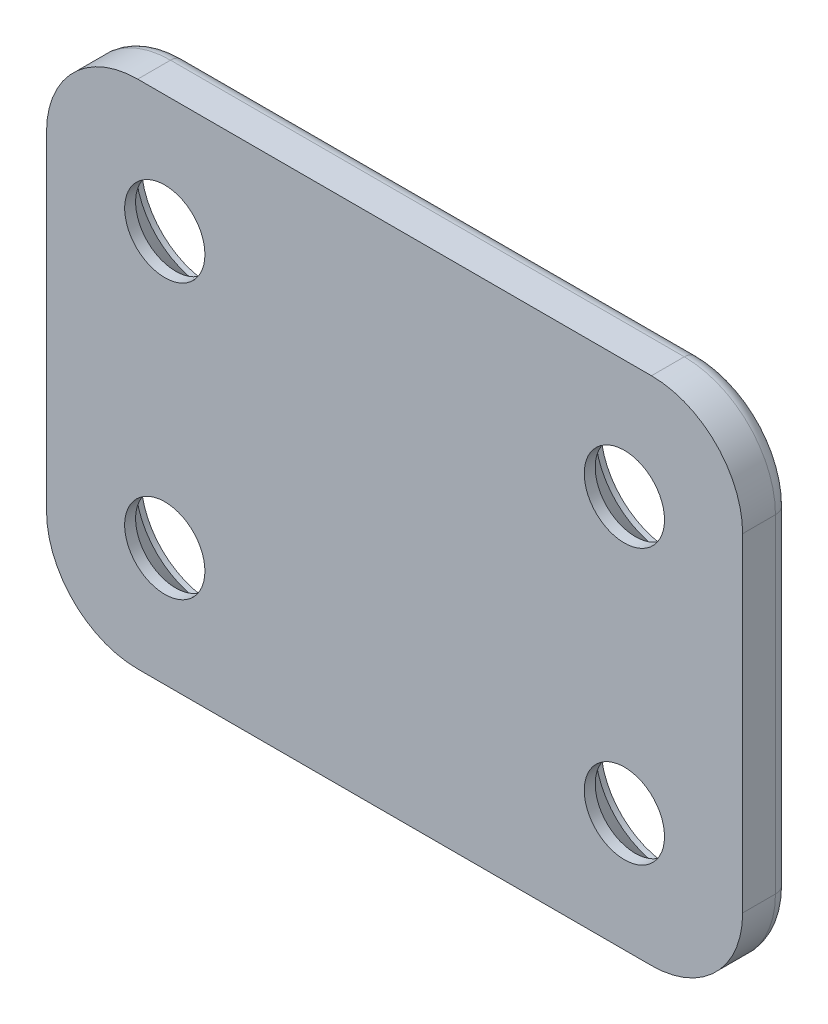
ISO-10303-21;
HEADER;
FILE_DESCRIPTION(('STEP AP214'),'2;1');
FILE_NAME('part.step','',(''),(''),'','','');
FILE_SCHEMA(('AUTOMOTIVE_DESIGN { 1 0 10303 214 1 1 1 1 }'));
ENDSEC;
DATA;
#1=APPLICATION_CONTEXT('core data for automotive mechanical design processes');
#2=APPLICATION_PROTOCOL_DEFINITION('international standard','automotive_design',2000,#1);
#3=PRODUCT_CONTEXT('',#1,'mechanical');
#4=PRODUCT('Part','Part','',(#3));
#5=PRODUCT_RELATED_PRODUCT_CATEGORY('part','',(#4));
#6=PRODUCT_DEFINITION_FORMATION('','',#4);
#7=PRODUCT_DEFINITION_CONTEXT('part definition',#1,'design');
#8=PRODUCT_DEFINITION('design','',#6,#7);
#9=PRODUCT_DEFINITION_SHAPE('','',#8);
#10=(LENGTH_UNIT() NAMED_UNIT(*) SI_UNIT(.MILLI.,.METRE.));
#11=(NAMED_UNIT(*) PLANE_ANGLE_UNIT() SI_UNIT($,.RADIAN.));
#12=(NAMED_UNIT(*) SI_UNIT($,.STERADIAN.) SOLID_ANGLE_UNIT());
#13=UNCERTAINTY_MEASURE_WITH_UNIT(LENGTH_MEASURE(1.E-05),#10,'distance_accuracy_value','');
#14=(GEOMETRIC_REPRESENTATION_CONTEXT(3) GLOBAL_UNCERTAINTY_ASSIGNED_CONTEXT((#13)) GLOBAL_UNIT_ASSIGNED_CONTEXT((#10,
#11,#12)) REPRESENTATION_CONTEXT('',''));
#15=CARTESIAN_POINT('',(0.,0.,0.));
#16=DIRECTION('',(0.,0.,1.));
#17=DIRECTION('',(1.,0.,0.));
#18=AXIS2_PLACEMENT_3D('',#15,#16,#17);
#19=CARTESIAN_POINT('',(6.3,3.76,0.15));
#20=DIRECTION('',(0.,0.,-1.));
#21=DIRECTION('',(1.,0.,0.));
#22=AXIS2_PLACEMENT_3D('',#19,#20,#21);
#23=CONICAL_SURFACE('',#22,1.95,0.785398163397);
#24=DIRECTION('',(-0.707106781186547,0.,0.707106781186547));
#25=VECTOR('',#24,1.);
#26=CARTESIAN_POINT('',(7.825,3.76,0.575));
#27=LINE('',#26,#25);
#28=CARTESIAN_POINT('',(8.25,3.76,0.15));
#29=VERTEX_POINT('',#28);
#30=CARTESIAN_POINT('',(7.4,3.76,1.));
#31=VERTEX_POINT('',#30);
#32=EDGE_CURVE('E10',#29,#31,#27,.T.);
#33=ORIENTED_EDGE('',*,*,#32,.T.);
#34=CARTESIAN_POINT('',(6.3,3.76,1.));
#35=DIRECTION('',(0.,0.,1.));
#36=DIRECTION('',(1.,0.,0.));
#37=AXIS2_PLACEMENT_3D('',#34,#35,#36);
#38=CIRCLE('',#37,1.1);
#39=EDGE_CURVE('E333',#31,#31,#38,.T.);
#40=ORIENTED_EDGE('',*,*,#39,.T.);
#41=ORIENTED_EDGE('',*,*,#32,.F.);
#42=CARTESIAN_POINT('',(6.3,3.76,0.15));
#43=DIRECTION('',(0.,0.,1.));
#44=DIRECTION('',(1.,0.,0.));
#45=AXIS2_PLACEMENT_3D('',#42,#43,#44);
#46=CIRCLE('',#45,1.95);
#47=EDGE_CURVE('E301',#29,#29,#46,.T.);
#48=ORIENTED_EDGE('',*,*,#47,.F.);
#49=EDGE_LOOP('',(#33,#40,#41,#48));
#50=FACE_BOUND('',#49,.T.);
#51=ADVANCED_FACE('F15',(#50),#23,.F.);
#52=CARTESIAN_POINT('',(-6.3,3.76,0.15));
#53=DIRECTION('',(0.,0.,-1.));
#54=DIRECTION('',(1.,0.,0.));
#55=AXIS2_PLACEMENT_3D('',#52,#53,#54);
#56=CONICAL_SURFACE('',#55,1.95,0.785398163397);
#57=DIRECTION('',(-0.707106781186547,0.,0.707106781186547));
#58=VECTOR('',#57,1.);
#59=CARTESIAN_POINT('',(-4.775,3.76,0.575));
#60=LINE('',#59,#58);
#61=CARTESIAN_POINT('',(-4.35,3.76,0.15));
#62=VERTEX_POINT('',#61);
#63=CARTESIAN_POINT('',(-5.2,3.76,1.));
#64=VERTEX_POINT('',#63);
#65=EDGE_CURVE('E26',#62,#64,#60,.T.);
#66=ORIENTED_EDGE('',*,*,#65,.T.);
#67=CARTESIAN_POINT('',(-6.3,3.76,1.));
#68=DIRECTION('',(0.,0.,1.));
#69=DIRECTION('',(1.,0.,0.));
#70=AXIS2_PLACEMENT_3D('',#67,#68,#69);
#71=CIRCLE('',#70,1.1);
#72=EDGE_CURVE('E325',#64,#64,#71,.T.);
#73=ORIENTED_EDGE('',*,*,#72,.T.);
#74=ORIENTED_EDGE('',*,*,#65,.F.);
#75=CARTESIAN_POINT('',(-6.3,3.76,0.15));
#76=DIRECTION('',(0.,0.,1.));
#77=DIRECTION('',(1.,0.,0.));
#78=AXIS2_PLACEMENT_3D('',#75,#76,#77);
#79=CIRCLE('',#78,1.95);
#80=EDGE_CURVE('E317',#62,#62,#79,.T.);
#81=ORIENTED_EDGE('',*,*,#80,.F.);
#82=EDGE_LOOP('',(#66,#73,#74,#81));
#83=FACE_BOUND('',#82,.T.);
#84=ADVANCED_FACE('F544',(#83),#56,.F.);
#85=CARTESIAN_POINT('',(6.3,-3.76,0.15));
#86=DIRECTION('',(0.,0.,-1.));
#87=DIRECTION('',(1.,0.,0.));
#88=AXIS2_PLACEMENT_3D('',#85,#86,#87);
#89=CONICAL_SURFACE('',#88,1.95,0.785398163397);
#90=DIRECTION('',(-0.707106781186547,0.,0.707106781186547));
#91=VECTOR('',#90,1.);
#92=CARTESIAN_POINT('',(7.825,-3.76,0.575));
#93=LINE('',#92,#91);
#94=CARTESIAN_POINT('',(8.25,-3.76,0.15));
#95=VERTEX_POINT('',#94);
#96=CARTESIAN_POINT('',(7.4,-3.76,1.));
#97=VERTEX_POINT('',#96);
#98=EDGE_CURVE('E291',#95,#97,#93,.T.);
#99=ORIENTED_EDGE('',*,*,#98,.T.);
#100=CARTESIAN_POINT('',(6.3,-3.76,1.));
#101=DIRECTION('',(0.,0.,1.));
#102=DIRECTION('',(1.,0.,0.));
#103=AXIS2_PLACEMENT_3D('',#100,#101,#102);
#104=CIRCLE('',#103,1.1);
#105=EDGE_CURVE('E326',#97,#97,#104,.T.);
#106=ORIENTED_EDGE('',*,*,#105,.T.);
#107=ORIENTED_EDGE('',*,*,#98,.F.);
#108=CARTESIAN_POINT('',(6.3,-3.76,0.15));
#109=DIRECTION('',(0.,0.,1.));
#110=DIRECTION('',(1.,0.,0.));
#111=AXIS2_PLACEMENT_3D('',#108,#109,#110);
#112=CIRCLE('',#111,1.95);
#113=EDGE_CURVE('E381',#95,#95,#112,.T.);
#114=ORIENTED_EDGE('',*,*,#113,.F.);
#115=EDGE_LOOP('',(#99,#106,#107,#114));
#116=FACE_BOUND('',#115,.T.);
#117=ADVANCED_FACE('F549',(#116),#89,.F.);
#118=CARTESIAN_POINT('',(-6.3,-3.76,0.15));
#119=DIRECTION('',(0.,0.,-1.));
#120=DIRECTION('',(1.,0.,0.));
#121=AXIS2_PLACEMENT_3D('',#118,#119,#120);
#122=CONICAL_SURFACE('',#121,1.95,0.785398163397);
#123=DIRECTION('',(-0.707106781186547,0.,0.707106781186547));
#124=VECTOR('',#123,1.);
#125=CARTESIAN_POINT('',(-4.775,-3.76,0.575));
#126=LINE('',#125,#124);
#127=CARTESIAN_POINT('',(-4.35,-3.76,0.15));
#128=VERTEX_POINT('',#127);
#129=CARTESIAN_POINT('',(-5.2,-3.76,1.));
#130=VERTEX_POINT('',#129);
#131=EDGE_CURVE('E19',#128,#130,#126,.T.);
#132=ORIENTED_EDGE('',*,*,#131,.T.);
#133=CARTESIAN_POINT('',(-6.3,-3.76,1.));
#134=DIRECTION('',(0.,0.,1.));
#135=DIRECTION('',(1.,0.,0.));
#136=AXIS2_PLACEMENT_3D('',#133,#134,#135);
#137=CIRCLE('',#136,1.1);
#138=EDGE_CURVE('E245',#130,#130,#137,.T.);
#139=ORIENTED_EDGE('',*,*,#138,.T.);
#140=ORIENTED_EDGE('',*,*,#131,.F.);
#141=CARTESIAN_POINT('',(-6.3,-3.76,0.15));
#142=DIRECTION('',(0.,0.,1.));
#143=DIRECTION('',(1.,0.,0.));
#144=AXIS2_PLACEMENT_3D('',#141,#142,#143);
#145=CIRCLE('',#144,1.95);
#146=EDGE_CURVE('E382',#128,#128,#145,.T.);
#147=ORIENTED_EDGE('',*,*,#146,.F.);
#148=EDGE_LOOP('',(#132,#139,#140,#147));
#149=FACE_BOUND('',#148,.T.);
#150=ADVANCED_FACE('F560',(#149),#122,.F.);
#151=CARTESIAN_POINT('',(6.3,3.76,0.));
#152=DIRECTION('',(0.,0.,-1.));
#153=DIRECTION('',(1.,0.,0.));
#154=AXIS2_PLACEMENT_3D('',#151,#152,#153);
#155=CYLINDRICAL_SURFACE('',#154,1.95);
#156=DIRECTION('',(0.,0.,1.));
#157=VECTOR('',#156,1.);
#158=CARTESIAN_POINT('',(8.25,3.76,0.));
#159=LINE('',#158,#157);
#160=CARTESIAN_POINT('',(8.25,3.76,0.));
#161=VERTEX_POINT('',#160);
#162=EDGE_CURVE('E309',#161,#29,#159,.T.);
#163=ORIENTED_EDGE('',*,*,#162,.T.);
#164=ORIENTED_EDGE('',*,*,#47,.T.);
#165=ORIENTED_EDGE('',*,*,#162,.F.);
#166=CARTESIAN_POINT('',(6.3,3.76,0.));
#167=DIRECTION('',(0.,0.,1.));
#168=DIRECTION('',(1.,0.,0.));
#169=AXIS2_PLACEMENT_3D('',#166,#167,#168);
#170=CIRCLE('',#169,1.95);
#171=EDGE_CURVE('E344',#161,#161,#170,.T.);
#172=ORIENTED_EDGE('',*,*,#171,.F.);
#173=EDGE_LOOP('',(#163,#164,#165,#172));
#174=FACE_BOUND('',#173,.T.);
#175=ADVANCED_FACE('F563',(#174),#155,.F.);
#176=CARTESIAN_POINT('',(-6.3,3.76,0.));
#177=DIRECTION('',(0.,0.,-1.));
#178=DIRECTION('',(1.,0.,0.));
#179=AXIS2_PLACEMENT_3D('',#176,#177,#178);
#180=CYLINDRICAL_SURFACE('',#179,1.95);
#181=DIRECTION('',(0.,0.,1.));
#182=VECTOR('',#181,1.);
#183=CARTESIAN_POINT('',(-4.35,3.76,0.));
#184=LINE('',#183,#182);
#185=CARTESIAN_POINT('',(-4.35,3.76,0.));
#186=VERTEX_POINT('',#185);
#187=EDGE_CURVE('E321',#186,#62,#184,.T.);
#188=ORIENTED_EDGE('',*,*,#187,.T.);
#189=ORIENTED_EDGE('',*,*,#80,.T.);
#190=ORIENTED_EDGE('',*,*,#187,.F.);
#191=CARTESIAN_POINT('',(-6.3,3.76,0.));
#192=DIRECTION('',(0.,0.,1.));
#193=DIRECTION('',(1.,0.,0.));
#194=AXIS2_PLACEMENT_3D('',#191,#192,#193);
#195=CIRCLE('',#194,1.95);
#196=EDGE_CURVE('E348',#186,#186,#195,.T.);
#197=ORIENTED_EDGE('',*,*,#196,.F.);
#198=EDGE_LOOP('',(#188,#189,#190,#197));
#199=FACE_BOUND('',#198,.T.);
#200=ADVANCED_FACE('F467',(#199),#180,.F.);
#201=CARTESIAN_POINT('',(6.3,-3.76,0.));
#202=DIRECTION('',(0.,0.,-1.));
#203=DIRECTION('',(1.,0.,0.));
#204=AXIS2_PLACEMENT_3D('',#201,#202,#203);
#205=CYLINDRICAL_SURFACE('',#204,1.95);
#206=DIRECTION('',(0.,0.,1.));
#207=VECTOR('',#206,1.);
#208=CARTESIAN_POINT('',(8.25,-3.76,0.));
#209=LINE('',#208,#207);
#210=CARTESIAN_POINT('',(8.25,-3.76,0.));
#211=VERTEX_POINT('',#210);
#212=EDGE_CURVE('E377',#211,#95,#209,.T.);
#213=ORIENTED_EDGE('',*,*,#212,.T.);
#214=ORIENTED_EDGE('',*,*,#113,.T.);
#215=ORIENTED_EDGE('',*,*,#212,.F.);
#216=CARTESIAN_POINT('',(6.3,-3.76,0.));
#217=DIRECTION('',(0.,0.,1.));
#218=DIRECTION('',(1.,0.,0.));
#219=AXIS2_PLACEMENT_3D('',#216,#217,#218);
#220=CIRCLE('',#219,1.95);
#221=EDGE_CURVE('E278',#211,#211,#220,.T.);
#222=ORIENTED_EDGE('',*,*,#221,.F.);
#223=EDGE_LOOP('',(#213,#214,#215,#222));
#224=FACE_BOUND('',#223,.T.);
#225=ADVANCED_FACE('F554',(#224),#205,.F.);
#226=CARTESIAN_POINT('',(-6.3,-3.76,0.));
#227=DIRECTION('',(0.,0.,-1.));
#228=DIRECTION('',(1.,0.,0.));
#229=AXIS2_PLACEMENT_3D('',#226,#227,#228);
#230=CYLINDRICAL_SURFACE('',#229,1.95);
#231=DIRECTION('',(0.,0.,1.));
#232=VECTOR('',#231,1.);
#233=CARTESIAN_POINT('',(-4.35,-3.76,0.));
#234=LINE('',#233,#232);
#235=CARTESIAN_POINT('',(-4.35,-3.76,0.));
#236=VERTEX_POINT('',#235);
#237=EDGE_CURVE('E338',#236,#128,#234,.T.);
#238=ORIENTED_EDGE('',*,*,#237,.T.);
#239=ORIENTED_EDGE('',*,*,#146,.T.);
#240=ORIENTED_EDGE('',*,*,#237,.F.);
#241=CARTESIAN_POINT('',(-6.3,-3.76,0.));
#242=DIRECTION('',(0.,0.,1.));
#243=DIRECTION('',(1.,0.,0.));
#244=AXIS2_PLACEMENT_3D('',#241,#242,#243);
#245=CIRCLE('',#244,1.95);
#246=EDGE_CURVE('E274',#236,#236,#245,.T.);
#247=ORIENTED_EDGE('',*,*,#246,.F.);
#248=EDGE_LOOP('',(#238,#239,#240,#247));
#249=FACE_BOUND('',#248,.T.);
#250=ADVANCED_FACE('F557',(#249),#230,.F.);
#251=CARTESIAN_POINT('',(9.1425,4.5025,0.4));
#252=DIRECTION('',(0.,-1.,0.));
#253=DIRECTION('',(1.,0.,0.));
#254=AXIS2_PLACEMENT_3D('',#251,#252,#253);
#255=CYLINDRICAL_SURFACE('',#254,0.4);
#256=DIRECTION('',(0.,-1.,0.));
#257=VECTOR('',#256,1.);
#258=CARTESIAN_POINT('',(9.5425,4.5025,0.4));
#259=LINE('',#258,#257);
#260=CARTESIAN_POINT('',(9.5425,4.5025,0.4));
#261=VERTEX_POINT('',#260);
#262=CARTESIAN_POINT('',(9.5425,-4.5025,0.4));
#263=VERTEX_POINT('',#262);
#264=EDGE_CURVE('E249',#261,#263,#259,.T.);
#265=ORIENTED_EDGE('',*,*,#264,.T.);
#266=CARTESIAN_POINT('',(9.1425,-4.5025,0.4));
#267=DIRECTION('',(0.,1.,0.));
#268=DIRECTION('',(1.,0.,0.));
#269=AXIS2_PLACEMENT_3D('',#266,#267,#268);
#270=CIRCLE('',#269,0.4);
#271=CARTESIAN_POINT('',(9.1425,-4.5025,0.));
#272=VERTEX_POINT('',#271);
#273=EDGE_CURVE('E238',#263,#272,#270,.T.);
#274=ORIENTED_EDGE('',*,*,#273,.T.);
#275=DIRECTION('',(0.,-1.,0.));
#276=VECTOR('',#275,1.);
#277=CARTESIAN_POINT('',(9.1425,4.5025,0.));
#278=LINE('',#277,#276);
#279=CARTESIAN_POINT('',(9.1425,4.5025,0.));
#280=VERTEX_POINT('',#279);
#281=EDGE_CURVE('E261',#280,#272,#278,.T.);
#282=ORIENTED_EDGE('',*,*,#281,.F.);
#283=CARTESIAN_POINT('',(9.1425,4.5025,0.4));
#284=DIRECTION('',(0.,1.,0.));
#285=DIRECTION('',(1.,0.,0.));
#286=AXIS2_PLACEMENT_3D('',#283,#284,#285);
#287=CIRCLE('',#286,0.4);
#288=EDGE_CURVE('E329',#261,#280,#287,.T.);
#289=ORIENTED_EDGE('',*,*,#288,.F.);
#290=EDGE_LOOP('',(#265,#274,#282,#289));
#291=FACE_BOUND('',#290,.T.);
#292=ADVANCED_FACE('F493',(#291),#255,.T.);
#293=CARTESIAN_POINT('',(7.0425,4.5025,0.4));
#294=DIRECTION('',(0.,0.,-1.));
#295=DIRECTION('',(0.,1.,0.));
#296=AXIS2_PLACEMENT_3D('',#293,#294,#295);
#297=TOROIDAL_SURFACE('',#296,2.1,0.4);
#298=CARTESIAN_POINT('',(7.0425,6.6025,0.4));
#299=DIRECTION('',(-1.,0.,0.));
#300=DIRECTION('',(0.,1.,0.));
#301=AXIS2_PLACEMENT_3D('',#298,#299,#300);
#302=CIRCLE('',#301,0.4);
#303=CARTESIAN_POINT('',(7.0425,7.0025,0.4));
#304=VERTEX_POINT('',#303);
#305=CARTESIAN_POINT('',(7.0425,6.6025,0.));
#306=VERTEX_POINT('',#305);
#307=EDGE_CURVE('E236',#304,#306,#302,.T.);
#308=ORIENTED_EDGE('',*,*,#307,.F.);
#309=CARTESIAN_POINT('',(7.0425,4.5025,0.4));
#310=DIRECTION('',(0.,0.,-1.));
#311=DIRECTION('',(0.,1.,0.));
#312=AXIS2_PLACEMENT_3D('',#309,#310,#311);
#313=CIRCLE('',#312,2.5);
#314=EDGE_CURVE('E207',#304,#261,#313,.T.);
#315=ORIENTED_EDGE('',*,*,#314,.T.);
#316=ORIENTED_EDGE('',*,*,#288,.T.);
#317=CARTESIAN_POINT('',(7.0425,4.5025,0.));
#318=DIRECTION('',(0.,0.,-1.));
#319=DIRECTION('',(0.,1.,0.));
#320=AXIS2_PLACEMENT_3D('',#317,#318,#319);
#321=CIRCLE('',#320,2.1);
#322=EDGE_CURVE('E257',#306,#280,#321,.T.);
#323=ORIENTED_EDGE('',*,*,#322,.F.);
#324=EDGE_LOOP('',(#308,#315,#316,#323));
#325=FACE_BOUND('',#324,.T.);
#326=ADVANCED_FACE('F489',(#325),#297,.T.);
#327=CARTESIAN_POINT('',(7.0425,-4.5025,0.4));
#328=DIRECTION('',(0.,0.,-1.));
#329=DIRECTION('',(1.,0.,0.));
#330=AXIS2_PLACEMENT_3D('',#327,#328,#329);
#331=TOROIDAL_SURFACE('',#330,2.1,0.4);
#332=ORIENTED_EDGE('',*,*,#273,.F.);
#333=CARTESIAN_POINT('',(7.0425,-4.5025,0.4));
#334=DIRECTION('',(0.,0.,-1.));
#335=DIRECTION('',(1.,0.,0.));
#336=AXIS2_PLACEMENT_3D('',#333,#334,#335);
#337=CIRCLE('',#336,2.5);
#338=CARTESIAN_POINT('',(7.0425,-7.0025,0.4));
#339=VERTEX_POINT('',#338);
#340=EDGE_CURVE('E356',#263,#339,#337,.T.);
#341=ORIENTED_EDGE('',*,*,#340,.T.);
#342=CARTESIAN_POINT('',(7.0425,-6.6025,0.4));
#343=DIRECTION('',(1.,0.,0.));
#344=DIRECTION('',(0.,-1.,0.));
#345=AXIS2_PLACEMENT_3D('',#342,#343,#344);
#346=CIRCLE('',#345,0.4);
#347=CARTESIAN_POINT('',(7.0425,-6.6025,0.));
#348=VERTEX_POINT('',#347);
#349=EDGE_CURVE('E239',#339,#348,#346,.T.);
#350=ORIENTED_EDGE('',*,*,#349,.T.);
#351=CARTESIAN_POINT('',(7.0425,-4.5025,0.));
#352=DIRECTION('',(0.,0.,-1.));
#353=DIRECTION('',(1.,0.,0.));
#354=AXIS2_PLACEMENT_3D('',#351,#352,#353);
#355=CIRCLE('',#354,2.1);
#356=EDGE_CURVE('E340',#272,#348,#355,.T.);
#357=ORIENTED_EDGE('',*,*,#356,.F.);
#358=EDGE_LOOP('',(#332,#341,#350,#357));
#359=FACE_BOUND('',#358,.T.);
#360=ADVANCED_FACE('F497',(#359),#331,.T.);
#361=CARTESIAN_POINT('',(-7.0425,6.6025,0.4));
#362=DIRECTION('',(1.,0.,0.));
#363=DIRECTION('',(0.,1.,0.));
#364=AXIS2_PLACEMENT_3D('',#361,#362,#363);
#365=CYLINDRICAL_SURFACE('',#364,0.4);
#366=DIRECTION('',(1.,0.,0.));
#367=VECTOR('',#366,1.);
#368=CARTESIAN_POINT('',(-7.0425,7.0025,0.4));
#369=LINE('',#368,#367);
#370=CARTESIAN_POINT('',(-7.0425,7.0025,0.4));
#371=VERTEX_POINT('',#370);
#372=EDGE_CURVE('E210',#371,#304,#369,.T.);
#373=ORIENTED_EDGE('',*,*,#372,.T.);
#374=ORIENTED_EDGE('',*,*,#307,.T.);
#375=DIRECTION('',(1.,0.,0.));
#376=VECTOR('',#375,1.);
#377=CARTESIAN_POINT('',(-7.0425,6.6025,0.));
#378=LINE('',#377,#376);
#379=CARTESIAN_POINT('',(-7.0425,6.6025,0.));
#380=VERTEX_POINT('',#379);
#381=EDGE_CURVE('E262',#380,#306,#378,.T.);
#382=ORIENTED_EDGE('',*,*,#381,.F.);
#383=CARTESIAN_POINT('',(-7.0425,6.6025,0.4));
#384=DIRECTION('',(-1.,0.,0.));
#385=DIRECTION('',(0.,1.,0.));
#386=AXIS2_PLACEMENT_3D('',#383,#384,#385);
#387=CIRCLE('',#386,0.4);
#388=EDGE_CURVE('E211',#371,#380,#387,.T.);
#389=ORIENTED_EDGE('',*,*,#388,.F.);
#390=EDGE_LOOP('',(#373,#374,#382,#389));
#391=FACE_BOUND('',#390,.T.);
#392=ADVANCED_FACE('F486',(#391),#365,.T.);
#393=CARTESIAN_POINT('',(7.0425,-6.6025,0.4));
#394=DIRECTION('',(-1.,0.,0.));
#395=DIRECTION('',(0.,-1.,0.));
#396=AXIS2_PLACEMENT_3D('',#393,#394,#395);
#397=CYLINDRICAL_SURFACE('',#396,0.4);
#398=DIRECTION('',(-1.,0.,0.));
#399=VECTOR('',#398,1.);
#400=CARTESIAN_POINT('',(7.0425,-7.0025,0.4));
#401=LINE('',#400,#399);
#402=CARTESIAN_POINT('',(-7.0425,-7.0025,0.4));
#403=VERTEX_POINT('',#402);
#404=EDGE_CURVE('E244',#339,#403,#401,.T.);
#405=ORIENTED_EDGE('',*,*,#404,.T.);
#406=CARTESIAN_POINT('',(-7.0425,-6.6025,0.4));
#407=DIRECTION('',(1.,0.,0.));
#408=DIRECTION('',(0.,-1.,0.));
#409=AXIS2_PLACEMENT_3D('',#406,#407,#408);
#410=CIRCLE('',#409,0.4);
#411=CARTESIAN_POINT('',(-7.0425,-6.6025,0.));
#412=VERTEX_POINT('',#411);
#413=EDGE_CURVE('E398',#403,#412,#410,.T.);
#414=ORIENTED_EDGE('',*,*,#413,.T.);
#415=DIRECTION('',(-1.,0.,0.));
#416=VECTOR('',#415,1.);
#417=CARTESIAN_POINT('',(7.0425,-6.6025,0.));
#418=LINE('',#417,#416);
#419=EDGE_CURVE('E279',#348,#412,#418,.T.);
#420=ORIENTED_EDGE('',*,*,#419,.F.);
#421=ORIENTED_EDGE('',*,*,#349,.F.);
#422=EDGE_LOOP('',(#405,#414,#420,#421));
#423=FACE_BOUND('',#422,.T.);
#424=ADVANCED_FACE('F502',(#423),#397,.T.);
#425=CARTESIAN_POINT('',(6.3,3.76,1.));
#426=DIRECTION('',(0.,0.,-1.));
#427=DIRECTION('',(1.,0.,0.));
#428=AXIS2_PLACEMENT_3D('',#425,#426,#427);
#429=CYLINDRICAL_SURFACE('',#428,1.1);
#430=ORIENTED_EDGE('',*,*,#39,.F.);
#431=DIRECTION('',(0.,0.,1.));
#432=VECTOR('',#431,1.);
#433=CARTESIAN_POINT('',(7.4,3.76,1.));
#434=LINE('',#433,#432);
#435=CARTESIAN_POINT('',(7.4,3.76,1.3));
#436=VERTEX_POINT('',#435);
#437=EDGE_CURVE('E330',#31,#436,#434,.T.);
#438=ORIENTED_EDGE('',*,*,#437,.T.);
#439=CARTESIAN_POINT('',(6.3,3.76,1.3));
#440=DIRECTION('',(0.,0.,-1.));
#441=DIRECTION('',(1.,0.,0.));
#442=AXIS2_PLACEMENT_3D('',#439,#440,#441);
#443=CIRCLE('',#442,1.1);
#444=EDGE_CURVE('E354',#436,#436,#443,.T.);
#445=ORIENTED_EDGE('',*,*,#444,.F.);
#446=ORIENTED_EDGE('',*,*,#437,.F.);
#447=EDGE_LOOP('',(#430,#438,#445,#446));
#448=FACE_BOUND('',#447,.T.);
#449=ADVANCED_FACE('F571',(#448),#429,.F.);
#450=CARTESIAN_POINT('',(-6.3,3.76,1.));
#451=DIRECTION('',(0.,0.,-1.));
#452=DIRECTION('',(1.,0.,0.));
#453=AXIS2_PLACEMENT_3D('',#450,#451,#452);
#454=CYLINDRICAL_SURFACE('',#453,1.1);
#455=ORIENTED_EDGE('',*,*,#72,.F.);
#456=DIRECTION('',(0.,0.,1.));
#457=VECTOR('',#456,1.);
#458=CARTESIAN_POINT('',(-5.2,3.76,1.));
#459=LINE('',#458,#457);
#460=CARTESIAN_POINT('',(-5.2,3.76,1.3));
#461=VERTEX_POINT('',#460);
#462=EDGE_CURVE('E396',#64,#461,#459,.T.);
#463=ORIENTED_EDGE('',*,*,#462,.T.);
#464=CARTESIAN_POINT('',(-6.3,3.76,1.3));
#465=DIRECTION('',(0.,0.,-1.));
#466=DIRECTION('',(1.,0.,0.));
#467=AXIS2_PLACEMENT_3D('',#464,#465,#466);
#468=CIRCLE('',#467,1.1);
#469=EDGE_CURVE('E406',#461,#461,#468,.T.);
#470=ORIENTED_EDGE('',*,*,#469,.F.);
#471=ORIENTED_EDGE('',*,*,#462,.F.);
#472=EDGE_LOOP('',(#455,#463,#470,#471));
#473=FACE_BOUND('',#472,.T.);
#474=ADVANCED_FACE('F568',(#473),#454,.F.);
#475=CARTESIAN_POINT('',(6.3,-3.76,1.));
#476=DIRECTION('',(0.,0.,-1.));
#477=DIRECTION('',(1.,0.,0.));
#478=AXIS2_PLACEMENT_3D('',#475,#476,#477);
#479=CYLINDRICAL_SURFACE('',#478,1.1);
#480=ORIENTED_EDGE('',*,*,#105,.F.);
#481=DIRECTION('',(0.,0.,1.));
#482=VECTOR('',#481,1.);
#483=CARTESIAN_POINT('',(7.4,-3.76,1.));
#484=LINE('',#483,#482);
#485=CARTESIAN_POINT('',(7.4,-3.76,1.3));
#486=VERTEX_POINT('',#485);
#487=EDGE_CURVE('E323',#97,#486,#484,.T.);
#488=ORIENTED_EDGE('',*,*,#487,.T.);
#489=CARTESIAN_POINT('',(6.3,-3.76,1.3));
#490=DIRECTION('',(0.,0.,-1.));
#491=DIRECTION('',(1.,0.,0.));
#492=AXIS2_PLACEMENT_3D('',#489,#490,#491);
#493=CIRCLE('',#492,1.1);
#494=EDGE_CURVE('E412',#486,#486,#493,.T.);
#495=ORIENTED_EDGE('',*,*,#494,.F.);
#496=ORIENTED_EDGE('',*,*,#487,.F.);
#497=EDGE_LOOP('',(#480,#488,#495,#496));
#498=FACE_BOUND('',#497,.T.);
#499=ADVANCED_FACE('F539',(#498),#479,.F.);
#500=CARTESIAN_POINT('',(-6.3,-3.76,1.));
#501=DIRECTION('',(0.,0.,-1.));
#502=DIRECTION('',(1.,0.,0.));
#503=AXIS2_PLACEMENT_3D('',#500,#501,#502);
#504=CYLINDRICAL_SURFACE('',#503,1.1);
#505=ORIENTED_EDGE('',*,*,#138,.F.);
#506=DIRECTION('',(0.,0.,1.));
#507=VECTOR('',#506,1.);
#508=CARTESIAN_POINT('',(-5.2,-3.76,1.));
#509=LINE('',#508,#507);
#510=CARTESIAN_POINT('',(-5.2,-3.76,1.3));
#511=VERTEX_POINT('',#510);
#512=EDGE_CURVE('E248',#130,#511,#509,.T.);
#513=ORIENTED_EDGE('',*,*,#512,.T.);
#514=CARTESIAN_POINT('',(-6.3,-3.76,1.3));
#515=DIRECTION('',(0.,0.,-1.));
#516=DIRECTION('',(1.,0.,0.));
#517=AXIS2_PLACEMENT_3D('',#514,#515,#516);
#518=CIRCLE('',#517,1.1);
#519=EDGE_CURVE('E265',#511,#511,#518,.T.);
#520=ORIENTED_EDGE('',*,*,#519,.F.);
#521=ORIENTED_EDGE('',*,*,#512,.F.);
#522=EDGE_LOOP('',(#505,#513,#520,#521));
#523=FACE_BOUND('',#522,.T.);
#524=ADVANCED_FACE('F531',(#523),#504,.F.);
#525=CARTESIAN_POINT('',(9.5425,-7.0025,0.));
#526=DIRECTION('',(1.,0.,0.));
#527=DIRECTION('',(0.,1.,0.));
#528=AXIS2_PLACEMENT_3D('',#525,#526,#527);
#529=PLANE('',#528);
#530=DIRECTION('',(0.,0.,1.));
#531=VECTOR('',#530,1.);
#532=CARTESIAN_POINT('',(9.5425,-4.5025,0.));
#533=LINE('',#532,#531);
#534=CARTESIAN_POINT('',(9.5425,-4.5025,1.3));
#535=VERTEX_POINT('',#534);
#536=EDGE_CURVE('E269',#263,#535,#533,.T.);
#537=ORIENTED_EDGE('',*,*,#536,.F.);
#538=ORIENTED_EDGE('',*,*,#264,.F.);
#539=DIRECTION('',(0.,0.,1.));
#540=VECTOR('',#539,1.);
#541=CARTESIAN_POINT('',(9.5425,4.5025,0.));
#542=LINE('',#541,#540);
#543=CARTESIAN_POINT('',(9.5425,4.5025,1.3));
#544=VERTEX_POINT('',#543);
#545=EDGE_CURVE('E266',#261,#544,#542,.T.);
#546=ORIENTED_EDGE('',*,*,#545,.T.);
#547=DIRECTION('',(0.,1.,0.));
#548=VECTOR('',#547,1.);
#549=CARTESIAN_POINT('',(9.5425,-7.0025,1.3));
#550=LINE('',#549,#548);
#551=EDGE_CURVE('E223',#535,#544,#550,.T.);
#552=ORIENTED_EDGE('',*,*,#551,.F.);
#553=EDGE_LOOP('',(#537,#538,#546,#552));
#554=FACE_BOUND('',#553,.T.);
#555=ADVANCED_FACE('F529',(#554),#529,.T.);
#556=CARTESIAN_POINT('',(7.0425,4.5025,0.));
#557=DIRECTION('',(0.,0.,1.));
#558=DIRECTION('',(1.,0.,0.));
#559=AXIS2_PLACEMENT_3D('',#556,#557,#558);
#560=CYLINDRICAL_SURFACE('',#559,2.5);
#561=ORIENTED_EDGE('',*,*,#545,.F.);
#562=ORIENTED_EDGE('',*,*,#314,.F.);
#563=DIRECTION('',(0.,0.,1.));
#564=VECTOR('',#563,1.);
#565=CARTESIAN_POINT('',(7.0425,7.0025,0.));
#566=LINE('',#565,#564);
#567=CARTESIAN_POINT('',(7.0425,7.0025,1.3));
#568=VERTEX_POINT('',#567);
#569=EDGE_CURVE('E200',#304,#568,#566,.T.);
#570=ORIENTED_EDGE('',*,*,#569,.T.);
#571=CARTESIAN_POINT('',(7.0425,4.5025,1.3));
#572=DIRECTION('',(0.,0.,1.));
#573=DIRECTION('',(0.,-1.,0.));
#574=AXIS2_PLACEMENT_3D('',#571,#572,#573);
#575=CIRCLE('',#574,2.5);
#576=EDGE_CURVE('E204',#544,#568,#575,.T.);
#577=ORIENTED_EDGE('',*,*,#576,.F.);
#578=EDGE_LOOP('',(#561,#562,#570,#577));
#579=FACE_BOUND('',#578,.T.);
#580=ADVANCED_FACE('F202',(#579),#560,.T.);
#581=CARTESIAN_POINT('',(7.0425,-4.5025,0.));
#582=DIRECTION('',(0.,0.,1.));
#583=DIRECTION('',(1.,0.,0.));
#584=AXIS2_PLACEMENT_3D('',#581,#582,#583);
#585=CYLINDRICAL_SURFACE('',#584,2.5);
#586=CARTESIAN_POINT('',(7.0425,-4.5025,1.3));
#587=DIRECTION('',(0.,0.,-1.));
#588=DIRECTION('',(0.,-1.,0.));
#589=AXIS2_PLACEMENT_3D('',#586,#587,#588);
#590=CIRCLE('',#589,2.5);
#591=CARTESIAN_POINT('',(7.0425,-7.0025,1.3));
#592=VERTEX_POINT('',#591);
#593=EDGE_CURVE('E230',#535,#592,#590,.T.);
#594=ORIENTED_EDGE('',*,*,#593,.T.);
#595=DIRECTION('',(0.,0.,1.));
#596=VECTOR('',#595,1.);
#597=CARTESIAN_POINT('',(7.0425,-7.0025,0.));
#598=LINE('',#597,#596);
#599=EDGE_CURVE('E240',#339,#592,#598,.T.);
#600=ORIENTED_EDGE('',*,*,#599,.F.);
#601=ORIENTED_EDGE('',*,*,#340,.F.);
#602=ORIENTED_EDGE('',*,*,#536,.T.);
#603=EDGE_LOOP('',(#594,#600,#601,#602));
#604=FACE_BOUND('',#603,.T.);
#605=ADVANCED_FACE('F527',(#604),#585,.T.);
#606=CARTESIAN_POINT('',(-9.5425,7.0025,0.));
#607=DIRECTION('',(0.,1.,0.));
#608=DIRECTION('',(1.,0.,0.));
#609=AXIS2_PLACEMENT_3D('',#606,#607,#608);
#610=PLANE('',#609);
#611=DIRECTION('',(0.,0.,1.));
#612=VECTOR('',#611,1.);
#613=CARTESIAN_POINT('',(-7.0425,7.0025,0.));
#614=LINE('',#613,#612);
#615=CARTESIAN_POINT('',(-7.0425,7.0025,1.3));
#616=VERTEX_POINT('',#615);
#617=EDGE_CURVE('E191',#371,#616,#614,.T.);
#618=ORIENTED_EDGE('',*,*,#617,.T.);
#619=DIRECTION('',(1.,0.,0.));
#620=VECTOR('',#619,1.);
#621=CARTESIAN_POINT('',(-9.5425,7.0025,1.3));
#622=LINE('',#621,#620);
#623=EDGE_CURVE('E214',#616,#568,#622,.T.);
#624=ORIENTED_EDGE('',*,*,#623,.T.);
#625=ORIENTED_EDGE('',*,*,#569,.F.);
#626=ORIENTED_EDGE('',*,*,#372,.F.);
#627=EDGE_LOOP('',(#618,#624,#625,#626));
#628=FACE_BOUND('',#627,.T.);
#629=ADVANCED_FACE('F215',(#628),#610,.T.);
#630=CARTESIAN_POINT('',(-7.0425,4.5025,0.4));
#631=DIRECTION('',(0.,0.,-1.));
#632=DIRECTION('',(-1.,0.,0.));
#633=AXIS2_PLACEMENT_3D('',#630,#631,#632);
#634=TOROIDAL_SURFACE('',#633,2.1,0.4);
#635=CARTESIAN_POINT('',(-9.1425,4.5025,0.4));
#636=DIRECTION('',(0.,-1.,0.));
#637=DIRECTION('',(-1.,0.,0.));
#638=AXIS2_PLACEMENT_3D('',#635,#636,#637);
#639=CIRCLE('',#638,0.4);
#640=CARTESIAN_POINT('',(-9.5425,4.5025,0.4));
#641=VERTEX_POINT('',#640);
#642=CARTESIAN_POINT('',(-9.1425,4.5025,0.));
#643=VERTEX_POINT('',#642);
#644=EDGE_CURVE('E256',#641,#643,#639,.T.);
#645=ORIENTED_EDGE('',*,*,#644,.F.);
#646=CARTESIAN_POINT('',(-7.0425,4.5025,0.4));
#647=DIRECTION('',(0.,0.,-1.));
#648=DIRECTION('',(-1.,0.,0.));
#649=AXIS2_PLACEMENT_3D('',#646,#647,#648);
#650=CIRCLE('',#649,2.5);
#651=EDGE_CURVE('E353',#641,#371,#650,.T.);
#652=ORIENTED_EDGE('',*,*,#651,.T.);
#653=ORIENTED_EDGE('',*,*,#388,.T.);
#654=CARTESIAN_POINT('',(-7.0425,4.5025,0.));
#655=DIRECTION('',(0.,0.,-1.));
#656=DIRECTION('',(-1.,0.,0.));
#657=AXIS2_PLACEMENT_3D('',#654,#655,#656);
#658=CIRCLE('',#657,2.1);
#659=EDGE_CURVE('E243',#643,#380,#658,.T.);
#660=ORIENTED_EDGE('',*,*,#659,.F.);
#661=EDGE_LOOP('',(#645,#652,#653,#660));
#662=FACE_BOUND('',#661,.T.);
#663=ADVANCED_FACE('F474',(#662),#634,.T.);
#664=CARTESIAN_POINT('',(-9.5425,-7.0025,0.));
#665=DIRECTION('',(0.,0.,1.));
#666=DIRECTION('',(1.,0.,0.));
#667=AXIS2_PLACEMENT_3D('',#664,#665,#666);
#668=PLANE('',#667);
#669=ORIENTED_EDGE('',*,*,#171,.T.);
#670=EDGE_LOOP('',(#669));
#671=FACE_BOUND('',#670,.T.);
#672=ORIENTED_EDGE('',*,*,#196,.T.);
#673=EDGE_LOOP('',(#672));
#674=FACE_BOUND('',#673,.T.);
#675=ORIENTED_EDGE('',*,*,#221,.T.);
#676=EDGE_LOOP('',(#675));
#677=FACE_BOUND('',#676,.T.);
#678=ORIENTED_EDGE('',*,*,#246,.T.);
#679=EDGE_LOOP('',(#678));
#680=FACE_BOUND('',#679,.T.);
#681=ORIENTED_EDGE('',*,*,#659,.T.);
#682=ORIENTED_EDGE('',*,*,#381,.T.);
#683=ORIENTED_EDGE('',*,*,#322,.T.);
#684=ORIENTED_EDGE('',*,*,#281,.T.);
#685=ORIENTED_EDGE('',*,*,#356,.T.);
#686=ORIENTED_EDGE('',*,*,#419,.T.);
#687=CARTESIAN_POINT('',(-7.0425,-4.5025,0.));
#688=DIRECTION('',(0.,0.,-1.));
#689=DIRECTION('',(0.,-1.,0.));
#690=AXIS2_PLACEMENT_3D('',#687,#688,#689);
#691=CIRCLE('',#690,2.1);
#692=CARTESIAN_POINT('',(-9.1425,-4.5025,0.));
#693=VERTEX_POINT('',#692);
#694=EDGE_CURVE('E402',#412,#693,#691,.T.);
#695=ORIENTED_EDGE('',*,*,#694,.T.);
#696=DIRECTION('',(0.,1.,0.));
#697=VECTOR('',#696,1.);
#698=CARTESIAN_POINT('',(-9.1425,-4.5025,0.));
#699=LINE('',#698,#697);
#700=EDGE_CURVE('E251',#693,#643,#699,.T.);
#701=ORIENTED_EDGE('',*,*,#700,.T.);
#702=EDGE_LOOP('',(#681,#682,#683,#684,#685,#686,#695,#701));
#703=FACE_BOUND('',#702,.T.);
#704=ADVANCED_FACE('F470',(#671,#674,#677,#680,#703),#668,.F.);
#705=CARTESIAN_POINT('',(-9.5425,-7.0025,0.));
#706=DIRECTION('',(0.,1.,0.));
#707=DIRECTION('',(1.,0.,0.));
#708=AXIS2_PLACEMENT_3D('',#705,#706,#707);
#709=PLANE('',#708);
#710=ORIENTED_EDGE('',*,*,#404,.F.);
#711=ORIENTED_EDGE('',*,*,#599,.T.);
#712=DIRECTION('',(1.,0.,0.));
#713=VECTOR('',#712,1.);
#714=CARTESIAN_POINT('',(-9.5425,-7.0025,1.3));
#715=LINE('',#714,#713);
#716=CARTESIAN_POINT('',(-7.0425,-7.0025,1.3));
#717=VERTEX_POINT('',#716);
#718=EDGE_CURVE('E273',#717,#592,#715,.T.);
#719=ORIENTED_EDGE('',*,*,#718,.F.);
#720=DIRECTION('',(0.,0.,1.));
#721=VECTOR('',#720,1.);
#722=CARTESIAN_POINT('',(-7.0425,-7.0025,0.));
#723=LINE('',#722,#721);
#724=EDGE_CURVE('E280',#403,#717,#723,.T.);
#725=ORIENTED_EDGE('',*,*,#724,.F.);
#726=EDGE_LOOP('',(#710,#711,#719,#725));
#727=FACE_BOUND('',#726,.T.);
#728=ADVANCED_FACE('F473',(#727),#709,.F.);
#729=CARTESIAN_POINT('',(-7.0425,-4.5025,0.4));
#730=DIRECTION('',(0.,0.,-1.));
#731=DIRECTION('',(0.,-1.,0.));
#732=AXIS2_PLACEMENT_3D('',#729,#730,#731);
#733=TOROIDAL_SURFACE('',#732,2.1,0.4);
#734=ORIENTED_EDGE('',*,*,#413,.F.);
#735=CARTESIAN_POINT('',(-7.0425,-4.5025,0.4));
#736=DIRECTION('',(0.,0.,-1.));
#737=DIRECTION('',(0.,-1.,0.));
#738=AXIS2_PLACEMENT_3D('',#735,#736,#737);
#739=CIRCLE('',#738,2.5);
#740=CARTESIAN_POINT('',(-9.5425,-4.5025,0.4));
#741=VERTEX_POINT('',#740);
#742=EDGE_CURVE('E285',#403,#741,#739,.T.);
#743=ORIENTED_EDGE('',*,*,#742,.T.);
#744=CARTESIAN_POINT('',(-9.1425,-4.5025,0.4));
#745=DIRECTION('',(0.,-1.,0.));
#746=DIRECTION('',(-1.,0.,0.));
#747=AXIS2_PLACEMENT_3D('',#744,#745,#746);
#748=CIRCLE('',#747,0.4);
#749=EDGE_CURVE('E255',#741,#693,#748,.T.);
#750=ORIENTED_EDGE('',*,*,#749,.T.);
#751=ORIENTED_EDGE('',*,*,#694,.F.);
#752=EDGE_LOOP('',(#734,#743,#750,#751));
#753=FACE_BOUND('',#752,.T.);
#754=ADVANCED_FACE('F506',(#753),#733,.T.);
#755=CARTESIAN_POINT('',(-7.0425,4.5025,0.));
#756=DIRECTION('',(0.,0.,1.));
#757=DIRECTION('',(-1.,0.,0.));
#758=AXIS2_PLACEMENT_3D('',#755,#756,#757);
#759=CYLINDRICAL_SURFACE('',#758,2.5);
#760=CARTESIAN_POINT('',(-7.0425,4.5025,1.3));
#761=DIRECTION('',(0.,0.,-1.));
#762=DIRECTION('',(0.,-1.,0.));
#763=AXIS2_PLACEMENT_3D('',#760,#761,#762);
#764=CIRCLE('',#763,2.5);
#765=CARTESIAN_POINT('',(-9.5425,4.5025,1.3));
#766=VERTEX_POINT('',#765);
#767=EDGE_CURVE('E218',#766,#616,#764,.T.);
#768=ORIENTED_EDGE('',*,*,#767,.T.);
#769=ORIENTED_EDGE('',*,*,#617,.F.);
#770=ORIENTED_EDGE('',*,*,#651,.F.);
#771=DIRECTION('',(0.,0.,1.));
#772=VECTOR('',#771,1.);
#773=CARTESIAN_POINT('',(-9.5425,4.5025,0.));
#774=LINE('',#773,#772);
#775=EDGE_CURVE('E361',#641,#766,#774,.T.);
#776=ORIENTED_EDGE('',*,*,#775,.T.);
#777=EDGE_LOOP('',(#768,#769,#770,#776));
#778=FACE_BOUND('',#777,.T.);
#779=ADVANCED_FACE('F518',(#778),#759,.T.);
#780=CARTESIAN_POINT('',(-9.5425,-7.0025,1.3));
#781=DIRECTION('',(0.,0.,1.));
#782=DIRECTION('',(1.,0.,0.));
#783=AXIS2_PLACEMENT_3D('',#780,#781,#782);
#784=PLANE('',#783);
#785=ORIENTED_EDGE('',*,*,#444,.T.);
#786=EDGE_LOOP('',(#785));
#787=FACE_BOUND('',#786,.T.);
#788=ORIENTED_EDGE('',*,*,#469,.T.);
#789=EDGE_LOOP('',(#788));
#790=FACE_BOUND('',#789,.T.);
#791=ORIENTED_EDGE('',*,*,#494,.T.);
#792=EDGE_LOOP('',(#791));
#793=FACE_BOUND('',#792,.T.);
#794=ORIENTED_EDGE('',*,*,#519,.T.);
#795=EDGE_LOOP('',(#794));
#796=FACE_BOUND('',#795,.T.);
#797=DIRECTION('',(0.,1.,0.));
#798=VECTOR('',#797,1.);
#799=CARTESIAN_POINT('',(-9.5425,-7.0025,1.3));
#800=LINE('',#799,#798);
#801=CARTESIAN_POINT('',(-9.5425,-4.5025,1.3));
#802=VERTEX_POINT('',#801);
#803=EDGE_CURVE('E234',#802,#766,#800,.T.);
#804=ORIENTED_EDGE('',*,*,#803,.F.);
#805=CARTESIAN_POINT('',(-7.0425,-4.5025,1.3));
#806=DIRECTION('',(0.,0.,1.));
#807=DIRECTION('',(0.,-1.,0.));
#808=AXIS2_PLACEMENT_3D('',#805,#806,#807);
#809=CIRCLE('',#808,2.5);
#810=EDGE_CURVE('E284',#802,#717,#809,.T.);
#811=ORIENTED_EDGE('',*,*,#810,.T.);
#812=ORIENTED_EDGE('',*,*,#718,.T.);
#813=ORIENTED_EDGE('',*,*,#593,.F.);
#814=ORIENTED_EDGE('',*,*,#551,.T.);
#815=ORIENTED_EDGE('',*,*,#576,.T.);
#816=ORIENTED_EDGE('',*,*,#623,.F.);
#817=ORIENTED_EDGE('',*,*,#767,.F.);
#818=EDGE_LOOP('',(#804,#811,#812,#813,#814,#815,#816,#817));
#819=FACE_BOUND('',#818,.T.);
#820=ADVANCED_FACE('F17',(#787,#790,#793,#796,#819),#784,.T.);
#821=CARTESIAN_POINT('',(-9.1425,-4.5025,0.4));
#822=DIRECTION('',(0.,1.,0.));
#823=DIRECTION('',(-1.,0.,0.));
#824=AXIS2_PLACEMENT_3D('',#821,#822,#823);
#825=CYLINDRICAL_SURFACE('',#824,0.4);
#826=DIRECTION('',(0.,1.,0.));
#827=VECTOR('',#826,1.);
#828=CARTESIAN_POINT('',(-9.5425,-4.5025,0.4));
#829=LINE('',#828,#827);
#830=EDGE_CURVE('E357',#741,#641,#829,.T.);
#831=ORIENTED_EDGE('',*,*,#830,.T.);
#832=ORIENTED_EDGE('',*,*,#644,.T.);
#833=ORIENTED_EDGE('',*,*,#700,.F.);
#834=ORIENTED_EDGE('',*,*,#749,.F.);
#835=EDGE_LOOP('',(#831,#832,#833,#834));
#836=FACE_BOUND('',#835,.T.);
#837=ADVANCED_FACE('F511',(#836),#825,.T.);
#838=CARTESIAN_POINT('',(-7.0425,-4.5025,0.));
#839=DIRECTION('',(0.,0.,1.));
#840=DIRECTION('',(-1.,0.,0.));
#841=AXIS2_PLACEMENT_3D('',#838,#839,#840);
#842=CYLINDRICAL_SURFACE('',#841,2.5);
#843=DIRECTION('',(0.,0.,1.));
#844=VECTOR('',#843,1.);
#845=CARTESIAN_POINT('',(-9.5425,-4.5025,0.));
#846=LINE('',#845,#844);
#847=EDGE_CURVE('E360',#741,#802,#846,.T.);
#848=ORIENTED_EDGE('',*,*,#847,.F.);
#849=ORIENTED_EDGE('',*,*,#742,.F.);
#850=ORIENTED_EDGE('',*,*,#724,.T.);
#851=ORIENTED_EDGE('',*,*,#810,.F.);
#852=EDGE_LOOP('',(#848,#849,#850,#851));
#853=FACE_BOUND('',#852,.T.);
#854=ADVANCED_FACE('F523',(#853),#842,.T.);
#855=CARTESIAN_POINT('',(-9.5425,-7.0025,0.));
#856=DIRECTION('',(1.,0.,0.));
#857=DIRECTION('',(0.,1.,0.));
#858=AXIS2_PLACEMENT_3D('',#855,#856,#857);
#859=PLANE('',#858);
#860=ORIENTED_EDGE('',*,*,#803,.T.);
#861=ORIENTED_EDGE('',*,*,#775,.F.);
#862=ORIENTED_EDGE('',*,*,#830,.F.);
#863=ORIENTED_EDGE('',*,*,#847,.T.);
#864=EDGE_LOOP('',(#860,#861,#862,#863));
#865=FACE_BOUND('',#864,.T.);
#866=ADVANCED_FACE('F516',(#865),#859,.F.);
#867=CLOSED_SHELL('',(#51,#84,#117,#150,#175,#200,#225,#250,#292,#326,#360,#392,#424,#449,#474,
#499,#524,#555,#580,#605,#629,#663,#704,#728,#754,#779,#820,#837,#854,#866));
#868=MANIFOLD_SOLID_BREP('B1',#867);
#869=ADVANCED_BREP_SHAPE_REPRESENTATION('',(#18,#868),#14);
#870=SHAPE_DEFINITION_REPRESENTATION(#9,#869);
ENDSEC;
END-ISO-10303-21;
